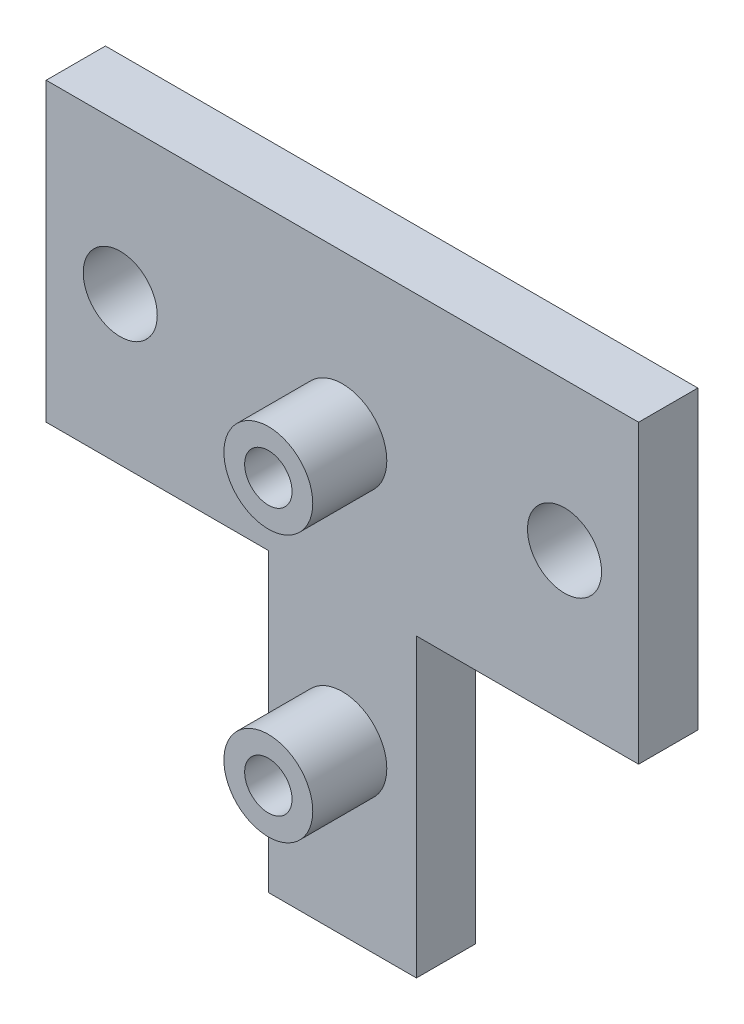
ISO-10303-21;
HEADER;
FILE_DESCRIPTION(('STEP AP214'),'2;1');
FILE_NAME('part.step','',(''),(''),'','','');
FILE_SCHEMA(('AUTOMOTIVE_DESIGN { 1 0 10303 214 1 1 1 1 }'));
ENDSEC;
DATA;
#1=APPLICATION_CONTEXT('core data for automotive mechanical design processes');
#2=APPLICATION_PROTOCOL_DEFINITION('international standard','automotive_design',2000,#1);
#3=PRODUCT_CONTEXT('',#1,'mechanical');
#4=PRODUCT('Part','Part','',(#3));
#5=PRODUCT_RELATED_PRODUCT_CATEGORY('part','',(#4));
#6=PRODUCT_DEFINITION_FORMATION('','',#4);
#7=PRODUCT_DEFINITION_CONTEXT('part definition',#1,'design');
#8=PRODUCT_DEFINITION('design','',#6,#7);
#9=PRODUCT_DEFINITION_SHAPE('','',#8);
#10=(LENGTH_UNIT() NAMED_UNIT(*) SI_UNIT(.MILLI.,.METRE.));
#11=(NAMED_UNIT(*) PLANE_ANGLE_UNIT() SI_UNIT($,.RADIAN.));
#12=(NAMED_UNIT(*) SI_UNIT($,.STERADIAN.) SOLID_ANGLE_UNIT());
#13=UNCERTAINTY_MEASURE_WITH_UNIT(LENGTH_MEASURE(1.E-05),#10,'distance_accuracy_value','');
#14=(GEOMETRIC_REPRESENTATION_CONTEXT(3) GLOBAL_UNCERTAINTY_ASSIGNED_CONTEXT((#13)) GLOBAL_UNIT_ASSIGNED_CONTEXT((#10,
#11,#12)) REPRESENTATION_CONTEXT('',''));
#15=CARTESIAN_POINT('',(0.,0.,0.));
#16=DIRECTION('',(0.,0.,1.));
#17=DIRECTION('',(1.,0.,0.));
#18=AXIS2_PLACEMENT_3D('',#15,#16,#17);
#19=CARTESIAN_POINT('',(-20.,26.4499999999999,4.));
#20=DIRECTION('',(0.,0.,-1.));
#21=DIRECTION('',(-1.,0.,0.));
#22=AXIS2_PLACEMENT_3D('',#19,#20,#21);
#23=CYLINDRICAL_SURFACE('',#22,1.6);
#24=CARTESIAN_POINT('',(-20.,26.4499999999999,9.));
#25=DIRECTION('',(0.,0.,1.));
#26=DIRECTION('',(1.,0.,0.));
#27=AXIS2_PLACEMENT_3D('',#24,#25,#26);
#28=CIRCLE('',#27,1.6);
#29=CARTESIAN_POINT('',(-18.4,26.4499999999999,9.));
#30=VERTEX_POINT('',#29);
#31=EDGE_CURVE('E201',#30,#30,#28,.T.);
#32=ORIENTED_EDGE('',*,*,#31,.T.);
#33=EDGE_LOOP('',(#32));
#34=FACE_BOUND('',#33,.T.);
#35=CARTESIAN_POINT('',(-20.,26.4499999999999,3.));
#36=DIRECTION('',(0.,0.,-1.));
#37=DIRECTION('',(-1.,0.,0.));
#38=AXIS2_PLACEMENT_3D('',#35,#36,#37);
#39=CIRCLE('',#38,1.6);
#40=CARTESIAN_POINT('',(-21.6,26.4499999999999,3.));
#41=VERTEX_POINT('',#40);
#42=EDGE_CURVE('E44',#41,#41,#39,.T.);
#43=ORIENTED_EDGE('',*,*,#42,.T.);
#44=EDGE_LOOP('',(#43));
#45=FACE_BOUND('',#44,.T.);
#46=ADVANCED_FACE('F40',(#34,#45),#23,.F.);
#47=CARTESIAN_POINT('',(-20.,8.44999999999995,4.));
#48=DIRECTION('',(0.,0.,-1.));
#49=DIRECTION('',(-1.,0.,0.));
#50=AXIS2_PLACEMENT_3D('',#47,#48,#49);
#51=CYLINDRICAL_SURFACE('',#50,1.6);
#52=CARTESIAN_POINT('',(-20.,8.44999999999995,9.));
#53=DIRECTION('',(0.,0.,1.));
#54=DIRECTION('',(1.,0.,0.));
#55=AXIS2_PLACEMENT_3D('',#52,#53,#54);
#56=CIRCLE('',#55,1.6);
#57=CARTESIAN_POINT('',(-18.4,8.44999999999995,9.));
#58=VERTEX_POINT('',#57);
#59=EDGE_CURVE('E196',#58,#58,#56,.T.);
#60=ORIENTED_EDGE('',*,*,#59,.T.);
#61=EDGE_LOOP('',(#60));
#62=FACE_BOUND('',#61,.T.);
#63=CARTESIAN_POINT('',(-20.,8.44999999999995,3.));
#64=DIRECTION('',(0.,0.,-1.));
#65=DIRECTION('',(-1.,0.,0.));
#66=AXIS2_PLACEMENT_3D('',#63,#64,#65);
#67=CIRCLE('',#66,1.6);
#68=CARTESIAN_POINT('',(-21.6,8.44999999999995,3.));
#69=VERTEX_POINT('',#68);
#70=EDGE_CURVE('E172',#69,#69,#67,.T.);
#71=ORIENTED_EDGE('',*,*,#70,.T.);
#72=EDGE_LOOP('',(#71));
#73=FACE_BOUND('',#72,.T.);
#74=ADVANCED_FACE('F249',(#62,#73),#51,.F.);
#75=CARTESIAN_POINT('',(0.,0.,4.));
#76=DIRECTION('',(0.,0.,1.));
#77=DIRECTION('',(1.,0.,0.));
#78=AXIS2_PLACEMENT_3D('',#75,#76,#77);
#79=PLANE('',#78);
#80=CARTESIAN_POINT('',(-20.,26.4499999999999,4.));
#81=DIRECTION('',(0.,0.,1.));
#82=DIRECTION('',(1.,0.,0.));
#83=AXIS2_PLACEMENT_3D('',#80,#81,#82);
#84=CIRCLE('',#83,3.);
#85=CARTESIAN_POINT('',(-17.,26.4499999999999,4.));
#86=VERTEX_POINT('',#85);
#87=EDGE_CURVE('E204',#86,#86,#84,.T.);
#88=ORIENTED_EDGE('',*,*,#87,.F.);
#89=EDGE_LOOP('',(#88));
#90=FACE_BOUND('',#89,.T.);
#91=CARTESIAN_POINT('',(-35.0000000000001,27.2,4.));
#92=DIRECTION('',(0.,0.,1.));
#93=DIRECTION('',(1.,0.,0.));
#94=AXIS2_PLACEMENT_3D('',#91,#92,#93);
#95=CIRCLE('',#94,2.5);
#96=CARTESIAN_POINT('',(-32.5000000000001,27.2,4.));
#97=VERTEX_POINT('',#96);
#98=EDGE_CURVE('E170',#97,#97,#95,.T.);
#99=ORIENTED_EDGE('',*,*,#98,.F.);
#100=EDGE_LOOP('',(#99));
#101=FACE_BOUND('',#100,.T.);
#102=CARTESIAN_POINT('',(-5.00000000000009,27.2,4.));
#103=DIRECTION('',(0.,0.,1.));
#104=DIRECTION('',(1.,0.,0.));
#105=AXIS2_PLACEMENT_3D('',#102,#103,#104);
#106=CIRCLE('',#105,2.5);
#107=CARTESIAN_POINT('',(-2.50000000000008,27.2,4.));
#108=VERTEX_POINT('',#107);
#109=EDGE_CURVE('E208',#108,#108,#106,.T.);
#110=ORIENTED_EDGE('',*,*,#109,.F.);
#111=EDGE_LOOP('',(#110));
#112=FACE_BOUND('',#111,.T.);
#113=DIRECTION('',(1.,0.,0.));
#114=VECTOR('',#113,1.);
#115=CARTESIAN_POINT('',(0.,37.2,4.));
#116=LINE('',#115,#114);
#117=CARTESIAN_POINT('',(-40.,37.2,4.));
#118=VERTEX_POINT('',#117);
#119=CARTESIAN_POINT('',(0.,37.2,4.));
#120=VERTEX_POINT('',#119);
#121=EDGE_CURVE('E155',#118,#120,#116,.T.);
#122=ORIENTED_EDGE('',*,*,#121,.F.);
#123=DIRECTION('',(0.,-1.,0.));
#124=VECTOR('',#123,1.);
#125=CARTESIAN_POINT('',(-40.,0.,4.));
#126=LINE('',#125,#124);
#127=CARTESIAN_POINT('',(-40.,17.2,4.));
#128=VERTEX_POINT('',#127);
#129=EDGE_CURVE('E216',#118,#128,#126,.T.);
#130=ORIENTED_EDGE('',*,*,#129,.T.);
#131=DIRECTION('',(1.,0.,0.));
#132=VECTOR('',#131,1.);
#133=CARTESIAN_POINT('',(0.,17.2,4.));
#134=LINE('',#133,#132);
#135=CARTESIAN_POINT('',(-25.,17.2,4.));
#136=VERTEX_POINT('',#135);
#137=EDGE_CURVE('E218',#128,#136,#134,.T.);
#138=ORIENTED_EDGE('',*,*,#137,.T.);
#139=DIRECTION('',(0.,-1.,0.));
#140=VECTOR('',#139,1.);
#141=CARTESIAN_POINT('',(-25.,0.,4.));
#142=LINE('',#141,#140);
#143=CARTESIAN_POINT('',(-25.,-2.8,4.));
#144=VERTEX_POINT('',#143);
#145=EDGE_CURVE('E133',#136,#144,#142,.T.);
#146=ORIENTED_EDGE('',*,*,#145,.T.);
#147=DIRECTION('',(1.,0.,0.));
#148=VECTOR('',#147,1.);
#149=CARTESIAN_POINT('',(0.,-2.8,4.));
#150=LINE('',#149,#148);
#151=CARTESIAN_POINT('',(-15.,-2.8,4.));
#152=VERTEX_POINT('',#151);
#153=EDGE_CURVE('E130',#144,#152,#150,.T.);
#154=ORIENTED_EDGE('',*,*,#153,.T.);
#155=DIRECTION('',(0.,-1.,0.));
#156=VECTOR('',#155,1.);
#157=CARTESIAN_POINT('',(-15.,0.,4.));
#158=LINE('',#157,#156);
#159=CARTESIAN_POINT('',(-15.,17.2,4.));
#160=VERTEX_POINT('',#159);
#161=EDGE_CURVE('E118',#160,#152,#158,.T.);
#162=ORIENTED_EDGE('',*,*,#161,.F.);
#163=DIRECTION('',(1.,0.,0.));
#164=VECTOR('',#163,1.);
#165=CARTESIAN_POINT('',(0.,17.2,4.));
#166=LINE('',#165,#164);
#167=CARTESIAN_POINT('',(0.,17.2,4.));
#168=VERTEX_POINT('',#167);
#169=EDGE_CURVE('E124',#160,#168,#166,.T.);
#170=ORIENTED_EDGE('',*,*,#169,.T.);
#171=DIRECTION('',(0.,1.,0.));
#172=VECTOR('',#171,1.);
#173=CARTESIAN_POINT('',(0.,0.,4.));
#174=LINE('',#173,#172);
#175=EDGE_CURVE('E59',#168,#120,#174,.T.);
#176=ORIENTED_EDGE('',*,*,#175,.T.);
#177=EDGE_LOOP('',(#122,#130,#138,#146,#154,#162,#170,#176));
#178=FACE_BOUND('',#177,.T.);
#179=CARTESIAN_POINT('',(-20.,8.44999999999995,4.));
#180=DIRECTION('',(0.,0.,1.));
#181=DIRECTION('',(1.,0.,0.));
#182=AXIS2_PLACEMENT_3D('',#179,#180,#181);
#183=CIRCLE('',#182,3.);
#184=CARTESIAN_POINT('',(-17.,8.44999999999995,4.));
#185=VERTEX_POINT('',#184);
#186=EDGE_CURVE('E193',#185,#185,#183,.T.);
#187=ORIENTED_EDGE('',*,*,#186,.F.);
#188=EDGE_LOOP('',(#187));
#189=FACE_BOUND('',#188,.T.);
#190=ADVANCED_FACE('F127',(#90,#101,#112,#178,#189),#79,.T.);
#191=CARTESIAN_POINT('',(0.,37.2,4.));
#192=DIRECTION('',(0.,1.,0.));
#193=DIRECTION('',(-1.,0.,0.));
#194=AXIS2_PLACEMENT_3D('',#191,#192,#193);
#195=PLANE('',#194);
#196=DIRECTION('',(1.,0.,0.));
#197=VECTOR('',#196,1.);
#198=CARTESIAN_POINT('',(0.,37.2,0.));
#199=LINE('',#198,#197);
#200=CARTESIAN_POINT('',(-40.,37.2,0.));
#201=VERTEX_POINT('',#200);
#202=CARTESIAN_POINT('',(0.,37.2,0.));
#203=VERTEX_POINT('',#202);
#204=EDGE_CURVE('E138',#201,#203,#199,.T.);
#205=ORIENTED_EDGE('',*,*,#204,.F.);
#206=DIRECTION('',(0.,0.,-1.));
#207=VECTOR('',#206,1.);
#208=CARTESIAN_POINT('',(-40.,37.2,4.));
#209=LINE('',#208,#207);
#210=EDGE_CURVE('E11',#118,#201,#209,.T.);
#211=ORIENTED_EDGE('',*,*,#210,.F.);
#212=ORIENTED_EDGE('',*,*,#121,.T.);
#213=DIRECTION('',(0.,0.,-1.));
#214=VECTOR('',#213,1.);
#215=CARTESIAN_POINT('',(0.,37.2,4.));
#216=LINE('',#215,#214);
#217=EDGE_CURVE('E93',#120,#203,#216,.T.);
#218=ORIENTED_EDGE('',*,*,#217,.T.);
#219=EDGE_LOOP('',(#205,#211,#212,#218));
#220=FACE_BOUND('',#219,.T.);
#221=ADVANCED_FACE('F42',(#220),#195,.T.);
#222=CARTESIAN_POINT('',(-40.,0.,4.));
#223=DIRECTION('',(1.,0.,0.));
#224=DIRECTION('',(0.,0.,-1.));
#225=AXIS2_PLACEMENT_3D('',#222,#223,#224);
#226=PLANE('',#225);
#227=DIRECTION('',(0.,-1.,0.));
#228=VECTOR('',#227,1.);
#229=CARTESIAN_POINT('',(-40.,0.,0.));
#230=LINE('',#229,#228);
#231=CARTESIAN_POINT('',(-40.,17.2,0.));
#232=VERTEX_POINT('',#231);
#233=EDGE_CURVE('E141',#201,#232,#230,.T.);
#234=ORIENTED_EDGE('',*,*,#233,.T.);
#235=DIRECTION('',(0.,0.,-1.));
#236=VECTOR('',#235,1.);
#237=CARTESIAN_POINT('',(-40.,17.2,4.));
#238=LINE('',#237,#236);
#239=EDGE_CURVE('E50',#128,#232,#238,.T.);
#240=ORIENTED_EDGE('',*,*,#239,.F.);
#241=ORIENTED_EDGE('',*,*,#129,.F.);
#242=ORIENTED_EDGE('',*,*,#210,.T.);
#243=EDGE_LOOP('',(#234,#240,#241,#242));
#244=FACE_BOUND('',#243,.T.);
#245=ADVANCED_FACE('F237',(#244),#226,.F.);
#246=CARTESIAN_POINT('',(0.,17.2,4.));
#247=DIRECTION('',(0.,1.,0.));
#248=DIRECTION('',(0.,0.,1.));
#249=AXIS2_PLACEMENT_3D('',#246,#247,#248);
#250=PLANE('',#249);
#251=DIRECTION('',(1.,0.,0.));
#252=VECTOR('',#251,1.);
#253=CARTESIAN_POINT('',(0.,17.2,0.));
#254=LINE('',#253,#252);
#255=CARTESIAN_POINT('',(-25.,17.2,0.));
#256=VERTEX_POINT('',#255);
#257=EDGE_CURVE('E144',#232,#256,#254,.T.);
#258=ORIENTED_EDGE('',*,*,#257,.T.);
#259=DIRECTION('',(0.,0.,-1.));
#260=VECTOR('',#259,1.);
#261=CARTESIAN_POINT('',(-25.,17.2,4.));
#262=LINE('',#261,#260);
#263=EDGE_CURVE('E162',#136,#256,#262,.T.);
#264=ORIENTED_EDGE('',*,*,#263,.F.);
#265=ORIENTED_EDGE('',*,*,#137,.F.);
#266=ORIENTED_EDGE('',*,*,#239,.T.);
#267=EDGE_LOOP('',(#258,#264,#265,#266));
#268=FACE_BOUND('',#267,.T.);
#269=ADVANCED_FACE('F240',(#268),#250,.F.);
#270=CARTESIAN_POINT('',(-25.,0.,4.));
#271=DIRECTION('',(1.,0.,0.));
#272=DIRECTION('',(0.,1.,0.));
#273=AXIS2_PLACEMENT_3D('',#270,#271,#272);
#274=PLANE('',#273);
#275=DIRECTION('',(0.,-1.,0.));
#276=VECTOR('',#275,1.);
#277=CARTESIAN_POINT('',(-25.,0.,0.));
#278=LINE('',#277,#276);
#279=CARTESIAN_POINT('',(-25.,-2.8,0.));
#280=VERTEX_POINT('',#279);
#281=EDGE_CURVE('E146',#256,#280,#278,.T.);
#282=ORIENTED_EDGE('',*,*,#281,.T.);
#283=DIRECTION('',(0.,0.,-1.));
#284=VECTOR('',#283,1.);
#285=CARTESIAN_POINT('',(-25.,-2.8,4.));
#286=LINE('',#285,#284);
#287=EDGE_CURVE('E159',#144,#280,#286,.T.);
#288=ORIENTED_EDGE('',*,*,#287,.F.);
#289=ORIENTED_EDGE('',*,*,#145,.F.);
#290=ORIENTED_EDGE('',*,*,#263,.T.);
#291=EDGE_LOOP('',(#282,#288,#289,#290));
#292=FACE_BOUND('',#291,.T.);
#293=ADVANCED_FACE('F224',(#292),#274,.F.);
#294=CARTESIAN_POINT('',(0.,-2.8,4.));
#295=DIRECTION('',(0.,1.,0.));
#296=DIRECTION('',(-1.,0.,0.));
#297=AXIS2_PLACEMENT_3D('',#294,#295,#296);
#298=PLANE('',#297);
#299=DIRECTION('',(1.,0.,0.));
#300=VECTOR('',#299,1.);
#301=CARTESIAN_POINT('',(0.,-2.8,0.));
#302=LINE('',#301,#300);
#303=CARTESIAN_POINT('',(-15.,-2.8,0.));
#304=VERTEX_POINT('',#303);
#305=EDGE_CURVE('E148',#280,#304,#302,.T.);
#306=ORIENTED_EDGE('',*,*,#305,.T.);
#307=DIRECTION('',(0.,0.,-1.));
#308=VECTOR('',#307,1.);
#309=CARTESIAN_POINT('',(-15.,-2.8,4.));
#310=LINE('',#309,#308);
#311=EDGE_CURVE('E121',#152,#304,#310,.T.);
#312=ORIENTED_EDGE('',*,*,#311,.F.);
#313=ORIENTED_EDGE('',*,*,#153,.F.);
#314=ORIENTED_EDGE('',*,*,#287,.T.);
#315=EDGE_LOOP('',(#306,#312,#313,#314));
#316=FACE_BOUND('',#315,.T.);
#317=ADVANCED_FACE('F228',(#316),#298,.F.);
#318=CARTESIAN_POINT('',(-15.,0.,4.));
#319=DIRECTION('',(1.,0.,0.));
#320=DIRECTION('',(0.,1.,0.));
#321=AXIS2_PLACEMENT_3D('',#318,#319,#320);
#322=PLANE('',#321);
#323=DIRECTION('',(0.,-1.,0.));
#324=VECTOR('',#323,1.);
#325=CARTESIAN_POINT('',(-15.,0.,0.));
#326=LINE('',#325,#324);
#327=CARTESIAN_POINT('',(-15.,17.2,0.));
#328=VERTEX_POINT('',#327);
#329=EDGE_CURVE('E120',#328,#304,#326,.T.);
#330=ORIENTED_EDGE('',*,*,#329,.F.);
#331=DIRECTION('',(0.,0.,-1.));
#332=VECTOR('',#331,1.);
#333=CARTESIAN_POINT('',(-15.,17.2,4.));
#334=LINE('',#333,#332);
#335=EDGE_CURVE('E114',#160,#328,#334,.T.);
#336=ORIENTED_EDGE('',*,*,#335,.F.);
#337=ORIENTED_EDGE('',*,*,#161,.T.);
#338=ORIENTED_EDGE('',*,*,#311,.T.);
#339=EDGE_LOOP('',(#330,#336,#337,#338));
#340=FACE_BOUND('',#339,.T.);
#341=ADVANCED_FACE('F116',(#340),#322,.T.);
#342=CARTESIAN_POINT('',(0.,17.2,4.));
#343=DIRECTION('',(0.,1.,0.));
#344=DIRECTION('',(0.,0.,1.));
#345=AXIS2_PLACEMENT_3D('',#342,#343,#344);
#346=PLANE('',#345);
#347=DIRECTION('',(1.,0.,0.));
#348=VECTOR('',#347,1.);
#349=CARTESIAN_POINT('',(0.,17.2,0.));
#350=LINE('',#349,#348);
#351=CARTESIAN_POINT('',(0.,17.2,0.));
#352=VERTEX_POINT('',#351);
#353=EDGE_CURVE('E86',#328,#352,#350,.T.);
#354=ORIENTED_EDGE('',*,*,#353,.T.);
#355=DIRECTION('',(0.,0.,-1.));
#356=VECTOR('',#355,1.);
#357=CARTESIAN_POINT('',(0.,17.2,4.));
#358=LINE('',#357,#356);
#359=EDGE_CURVE('E122',#168,#352,#358,.T.);
#360=ORIENTED_EDGE('',*,*,#359,.F.);
#361=ORIENTED_EDGE('',*,*,#169,.F.);
#362=ORIENTED_EDGE('',*,*,#335,.T.);
#363=EDGE_LOOP('',(#354,#360,#361,#362));
#364=FACE_BOUND('',#363,.T.);
#365=ADVANCED_FACE('F125',(#364),#346,.F.);
#366=CARTESIAN_POINT('',(0.,0.,4.));
#367=DIRECTION('',(-1.,0.,0.));
#368=DIRECTION('',(0.,-1.,0.));
#369=AXIS2_PLACEMENT_3D('',#366,#367,#368);
#370=PLANE('',#369);
#371=DIRECTION('',(0.,1.,0.));
#372=VECTOR('',#371,1.);
#373=CARTESIAN_POINT('',(0.,0.,0.));
#374=LINE('',#373,#372);
#375=EDGE_CURVE('E153',#352,#203,#374,.T.);
#376=ORIENTED_EDGE('',*,*,#375,.T.);
#377=ORIENTED_EDGE('',*,*,#217,.F.);
#378=ORIENTED_EDGE('',*,*,#175,.F.);
#379=ORIENTED_EDGE('',*,*,#359,.T.);
#380=EDGE_LOOP('',(#376,#377,#378,#379));
#381=FACE_BOUND('',#380,.T.);
#382=ADVANCED_FACE('F234',(#381),#370,.F.);
#383=CARTESIAN_POINT('',(0.,0.,0.));
#384=DIRECTION('',(0.,0.,1.));
#385=DIRECTION('',(1.,0.,0.));
#386=AXIS2_PLACEMENT_3D('',#383,#384,#385);
#387=PLANE('',#386);
#388=CARTESIAN_POINT('',(-20.,26.4499999999999,0.));
#389=DIRECTION('',(0.,0.,-1.));
#390=DIRECTION('',(-1.,0.,0.));
#391=AXIS2_PLACEMENT_3D('',#388,#389,#390);
#392=CIRCLE('',#391,2.5);
#393=CARTESIAN_POINT('',(-22.5,26.4499999999999,0.));
#394=VERTEX_POINT('',#393);
#395=EDGE_CURVE('E180',#394,#394,#392,.T.);
#396=ORIENTED_EDGE('',*,*,#395,.F.);
#397=EDGE_LOOP('',(#396));
#398=FACE_BOUND('',#397,.T.);
#399=CARTESIAN_POINT('',(-20.,8.44999999999995,0.));
#400=DIRECTION('',(0.,0.,-1.));
#401=DIRECTION('',(-1.,0.,0.));
#402=AXIS2_PLACEMENT_3D('',#399,#400,#401);
#403=CIRCLE('',#402,2.5);
#404=CARTESIAN_POINT('',(-22.5,8.44999999999995,0.));
#405=VERTEX_POINT('',#404);
#406=EDGE_CURVE('E185',#405,#405,#403,.T.);
#407=ORIENTED_EDGE('',*,*,#406,.F.);
#408=EDGE_LOOP('',(#407));
#409=FACE_BOUND('',#408,.T.);
#410=CARTESIAN_POINT('',(-35.0000000000001,27.2,0.));
#411=DIRECTION('',(0.,0.,1.));
#412=DIRECTION('',(1.,0.,0.));
#413=AXIS2_PLACEMENT_3D('',#410,#411,#412);
#414=CIRCLE('',#413,2.5);
#415=CARTESIAN_POINT('',(-32.5000000000001,27.2,0.));
#416=VERTEX_POINT('',#415);
#417=EDGE_CURVE('E142',#416,#416,#414,.T.);
#418=ORIENTED_EDGE('',*,*,#417,.T.);
#419=EDGE_LOOP('',(#418));
#420=FACE_BOUND('',#419,.T.);
#421=CARTESIAN_POINT('',(-5.00000000000009,27.2,0.));
#422=DIRECTION('',(0.,0.,1.));
#423=DIRECTION('',(1.,0.,0.));
#424=AXIS2_PLACEMENT_3D('',#421,#422,#423);
#425=CIRCLE('',#424,2.5);
#426=CARTESIAN_POINT('',(-2.50000000000008,27.2,0.));
#427=VERTEX_POINT('',#426);
#428=EDGE_CURVE('E167',#427,#427,#425,.T.);
#429=ORIENTED_EDGE('',*,*,#428,.T.);
#430=EDGE_LOOP('',(#429));
#431=FACE_BOUND('',#430,.T.);
#432=ORIENTED_EDGE('',*,*,#204,.T.);
#433=ORIENTED_EDGE('',*,*,#375,.F.);
#434=ORIENTED_EDGE('',*,*,#353,.F.);
#435=ORIENTED_EDGE('',*,*,#329,.T.);
#436=ORIENTED_EDGE('',*,*,#305,.F.);
#437=ORIENTED_EDGE('',*,*,#281,.F.);
#438=ORIENTED_EDGE('',*,*,#257,.F.);
#439=ORIENTED_EDGE('',*,*,#233,.F.);
#440=EDGE_LOOP('',(#432,#433,#434,#435,#436,#437,#438,#439));
#441=FACE_BOUND('',#440,.T.);
#442=ADVANCED_FACE('F230',(#398,#409,#420,#431,#441),#387,.F.);
#443=CARTESIAN_POINT('',(-5.00000000000009,27.2,-9.));
#444=DIRECTION('',(0.,0.,1.));
#445=DIRECTION('',(1.,0.,0.));
#446=AXIS2_PLACEMENT_3D('',#443,#444,#445);
#447=CYLINDRICAL_SURFACE('',#446,2.5);
#448=ORIENTED_EDGE('',*,*,#109,.T.);
#449=EDGE_LOOP('',(#448));
#450=FACE_BOUND('',#449,.T.);
#451=ORIENTED_EDGE('',*,*,#428,.F.);
#452=EDGE_LOOP('',(#451));
#453=FACE_BOUND('',#452,.T.);
#454=ADVANCED_FACE('F292',(#450,#453),#447,.F.);
#455=CARTESIAN_POINT('',(-35.0000000000001,27.2,-9.));
#456=DIRECTION('',(0.,0.,1.));
#457=DIRECTION('',(1.,0.,0.));
#458=AXIS2_PLACEMENT_3D('',#455,#456,#457);
#459=CYLINDRICAL_SURFACE('',#458,2.5);
#460=ORIENTED_EDGE('',*,*,#98,.T.);
#461=EDGE_LOOP('',(#460));
#462=FACE_BOUND('',#461,.T.);
#463=ORIENTED_EDGE('',*,*,#417,.F.);
#464=EDGE_LOOP('',(#463));
#465=FACE_BOUND('',#464,.T.);
#466=ADVANCED_FACE('F302',(#462,#465),#459,.F.);
#467=CARTESIAN_POINT('',(-20.,26.4499999999999,9.));
#468=DIRECTION('',(0.,0.,1.));
#469=DIRECTION('',(1.,0.,0.));
#470=AXIS2_PLACEMENT_3D('',#467,#468,#469);
#471=PLANE('',#470);
#472=CARTESIAN_POINT('',(-20.,26.4499999999999,9.));
#473=DIRECTION('',(0.,0.,1.));
#474=DIRECTION('',(1.,0.,0.));
#475=AXIS2_PLACEMENT_3D('',#472,#473,#474);
#476=CIRCLE('',#475,3.);
#477=CARTESIAN_POINT('',(-17.,26.4499999999999,9.));
#478=VERTEX_POINT('',#477);
#479=EDGE_CURVE('E205',#478,#478,#476,.T.);
#480=ORIENTED_EDGE('',*,*,#479,.T.);
#481=EDGE_LOOP('',(#480));
#482=FACE_BOUND('',#481,.T.);
#483=ORIENTED_EDGE('',*,*,#31,.F.);
#484=EDGE_LOOP('',(#483));
#485=FACE_BOUND('',#484,.T.);
#486=ADVANCED_FACE('F309',(#482,#485),#471,.T.);
#487=CARTESIAN_POINT('',(-20.,26.4499999999999,9.));
#488=DIRECTION('',(0.,0.,-1.));
#489=DIRECTION('',(-1.,0.,0.));
#490=AXIS2_PLACEMENT_3D('',#487,#488,#489);
#491=CYLINDRICAL_SURFACE('',#490,3.);
#492=ORIENTED_EDGE('',*,*,#479,.F.);
#493=EDGE_LOOP('',(#492));
#494=FACE_BOUND('',#493,.T.);
#495=ORIENTED_EDGE('',*,*,#87,.T.);
#496=EDGE_LOOP('',(#495));
#497=FACE_BOUND('',#496,.T.);
#498=ADVANCED_FACE('F318',(#494,#497),#491,.T.);
#499=CARTESIAN_POINT('',(-20.,8.44999999999995,9.));
#500=DIRECTION('',(0.,0.,1.));
#501=DIRECTION('',(1.,0.,0.));
#502=AXIS2_PLACEMENT_3D('',#499,#500,#501);
#503=PLANE('',#502);
#504=CARTESIAN_POINT('',(-20.,8.44999999999995,9.));
#505=DIRECTION('',(0.,0.,1.));
#506=DIRECTION('',(1.,0.,0.));
#507=AXIS2_PLACEMENT_3D('',#504,#505,#506);
#508=CIRCLE('',#507,3.);
#509=CARTESIAN_POINT('',(-17.,8.44999999999995,9.));
#510=VERTEX_POINT('',#509);
#511=EDGE_CURVE('E178',#510,#510,#508,.T.);
#512=ORIENTED_EDGE('',*,*,#511,.T.);
#513=EDGE_LOOP('',(#512));
#514=FACE_BOUND('',#513,.T.);
#515=ORIENTED_EDGE('',*,*,#59,.F.);
#516=EDGE_LOOP('',(#515));
#517=FACE_BOUND('',#516,.T.);
#518=ADVANCED_FACE('F326',(#514,#517),#503,.T.);
#519=CARTESIAN_POINT('',(-20.,8.44999999999995,9.));
#520=DIRECTION('',(0.,0.,-1.));
#521=DIRECTION('',(-1.,0.,0.));
#522=AXIS2_PLACEMENT_3D('',#519,#520,#521);
#523=CYLINDRICAL_SURFACE('',#522,3.);
#524=ORIENTED_EDGE('',*,*,#511,.F.);
#525=EDGE_LOOP('',(#524));
#526=FACE_BOUND('',#525,.T.);
#527=ORIENTED_EDGE('',*,*,#186,.T.);
#528=EDGE_LOOP('',(#527));
#529=FACE_BOUND('',#528,.T.);
#530=ADVANCED_FACE('F334',(#526,#529),#523,.T.);
#531=CARTESIAN_POINT('',(-20.,8.44999999999995,3.));
#532=DIRECTION('',(0.,0.,-1.));
#533=DIRECTION('',(-1.,0.,0.));
#534=AXIS2_PLACEMENT_3D('',#531,#532,#533);
#535=CYLINDRICAL_SURFACE('',#534,2.5);
#536=CARTESIAN_POINT('',(-20.,8.44999999999995,3.));
#537=DIRECTION('',(0.,0.,-1.));
#538=DIRECTION('',(-1.,0.,0.));
#539=AXIS2_PLACEMENT_3D('',#536,#537,#538);
#540=CIRCLE('',#539,2.5);
#541=CARTESIAN_POINT('',(-22.5,8.44999999999995,3.));
#542=VERTEX_POINT('',#541);
#543=EDGE_CURVE('E190',#542,#542,#540,.T.);
#544=ORIENTED_EDGE('',*,*,#543,.F.);
#545=EDGE_LOOP('',(#544));
#546=FACE_BOUND('',#545,.T.);
#547=ORIENTED_EDGE('',*,*,#406,.T.);
#548=EDGE_LOOP('',(#547));
#549=FACE_BOUND('',#548,.T.);
#550=ADVANCED_FACE('F341',(#546,#549),#535,.F.);
#551=CARTESIAN_POINT('',(-20.,8.44999999999995,3.));
#552=DIRECTION('',(0.,0.,-1.));
#553=DIRECTION('',(-1.,0.,0.));
#554=AXIS2_PLACEMENT_3D('',#551,#552,#553);
#555=PLANE('',#554);
#556=ORIENTED_EDGE('',*,*,#70,.F.);
#557=EDGE_LOOP('',(#556));
#558=FACE_BOUND('',#557,.T.);
#559=ORIENTED_EDGE('',*,*,#543,.T.);
#560=EDGE_LOOP('',(#559));
#561=FACE_BOUND('',#560,.T.);
#562=ADVANCED_FACE('F360',(#558,#561),#555,.T.);
#563=CARTESIAN_POINT('',(-20.,26.4499999999999,3.));
#564=DIRECTION('',(0.,0.,-1.));
#565=DIRECTION('',(-1.,0.,0.));
#566=AXIS2_PLACEMENT_3D('',#563,#564,#565);
#567=CYLINDRICAL_SURFACE('',#566,2.5);
#568=CARTESIAN_POINT('',(-20.,26.4499999999999,3.));
#569=DIRECTION('',(0.,0.,-1.));
#570=DIRECTION('',(-1.,0.,0.));
#571=AXIS2_PLACEMENT_3D('',#568,#569,#570);
#572=CIRCLE('',#571,2.5);
#573=CARTESIAN_POINT('',(-22.5,26.4499999999999,3.));
#574=VERTEX_POINT('',#573);
#575=EDGE_CURVE('E174',#574,#574,#572,.T.);
#576=ORIENTED_EDGE('',*,*,#575,.F.);
#577=EDGE_LOOP('',(#576));
#578=FACE_BOUND('',#577,.T.);
#579=ORIENTED_EDGE('',*,*,#395,.T.);
#580=EDGE_LOOP('',(#579));
#581=FACE_BOUND('',#580,.T.);
#582=ADVANCED_FACE('F368',(#578,#581),#567,.F.);
#583=CARTESIAN_POINT('',(-20.,26.4499999999999,3.));
#584=DIRECTION('',(0.,0.,-1.));
#585=DIRECTION('',(-1.,0.,0.));
#586=AXIS2_PLACEMENT_3D('',#583,#584,#585);
#587=PLANE('',#586);
#588=ORIENTED_EDGE('',*,*,#42,.F.);
#589=EDGE_LOOP('',(#588));
#590=FACE_BOUND('',#589,.T.);
#591=ORIENTED_EDGE('',*,*,#575,.T.);
#592=EDGE_LOOP('',(#591));
#593=FACE_BOUND('',#592,.T.);
#594=ADVANCED_FACE('F376',(#590,#593),#587,.T.);
#595=CLOSED_SHELL('',(#46,#74,#190,#221,#245,#269,#293,#317,#341,#365,#382,#442,#454,#466,#486,
#498,#518,#530,#550,#562,#582,#594));
#596=MANIFOLD_SOLID_BREP('B2',#595);
#597=ADVANCED_BREP_SHAPE_REPRESENTATION('',(#18,#596),#14);
#598=SHAPE_DEFINITION_REPRESENTATION(#9,#597);
ENDSEC;
END-ISO-10303-21;
